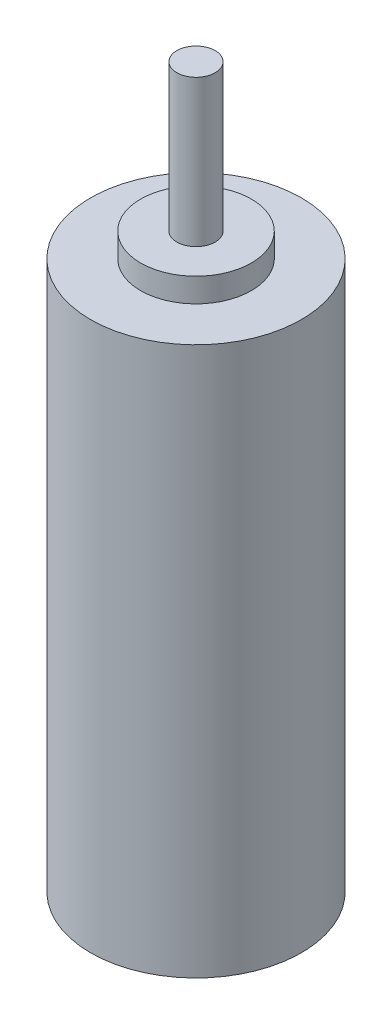
ISO-10303-21;
HEADER;
FILE_DESCRIPTION(('STEP AP214'),'2;1');
FILE_NAME('part.step','',(''),(''),'','','');
FILE_SCHEMA(('AUTOMOTIVE_DESIGN { 1 0 10303 214 1 1 1 1 }'));
ENDSEC;
DATA;
#1=APPLICATION_CONTEXT('core data for automotive mechanical design processes');
#2=APPLICATION_PROTOCOL_DEFINITION('international standard','automotive_design',2000,#1);
#3=PRODUCT_CONTEXT('',#1,'mechanical');
#4=PRODUCT('Part','Part','',(#3));
#5=PRODUCT_RELATED_PRODUCT_CATEGORY('part','',(#4));
#6=PRODUCT_DEFINITION_FORMATION('','',#4);
#7=PRODUCT_DEFINITION_CONTEXT('part definition',#1,'design');
#8=PRODUCT_DEFINITION('design','',#6,#7);
#9=PRODUCT_DEFINITION_SHAPE('','',#8);
#10=(LENGTH_UNIT() NAMED_UNIT(*) SI_UNIT(.MILLI.,.METRE.));
#11=(NAMED_UNIT(*) PLANE_ANGLE_UNIT() SI_UNIT($,.RADIAN.));
#12=(NAMED_UNIT(*) SI_UNIT($,.STERADIAN.) SOLID_ANGLE_UNIT());
#13=UNCERTAINTY_MEASURE_WITH_UNIT(LENGTH_MEASURE(1.E-05),#10,'distance_accuracy_value','');
#14=(GEOMETRIC_REPRESENTATION_CONTEXT(3) GLOBAL_UNCERTAINTY_ASSIGNED_CONTEXT((#13)) GLOBAL_UNIT_ASSIGNED_CONTEXT((#10,
#11,#12)) REPRESENTATION_CONTEXT('',''));
#15=CARTESIAN_POINT('',(0.,0.,0.));
#16=DIRECTION('',(0.,0.,1.));
#17=DIRECTION('',(1.,0.,0.));
#18=AXIS2_PLACEMENT_3D('',#15,#16,#17);
#19=CARTESIAN_POINT('',(0.,57.2,0.));
#20=DIRECTION('',(0.,-1.,0.));
#21=DIRECTION('',(0.,0.,-1.));
#22=AXIS2_PLACEMENT_3D('',#19,#20,#21);
#23=CYLINDRICAL_SURFACE('',#22,11.);
#24=CARTESIAN_POINT('',(0.,57.2,0.));
#25=DIRECTION('',(0.,1.,0.));
#26=DIRECTION('',(0.,0.,1.));
#27=AXIS2_PLACEMENT_3D('',#24,#25,#26);
#28=CIRCLE('',#27,11.);
#29=CARTESIAN_POINT('',(0.,57.2,11.));
#30=VERTEX_POINT('',#29);
#31=EDGE_CURVE('E47',#30,#30,#28,.T.);
#32=ORIENTED_EDGE('',*,*,#31,.F.);
#33=EDGE_LOOP('',(#32));
#34=FACE_BOUND('',#33,.T.);
#35=CARTESIAN_POINT('',(0.,0.,0.));
#36=DIRECTION('',(0.,1.,0.));
#37=DIRECTION('',(0.,0.,1.));
#38=AXIS2_PLACEMENT_3D('',#35,#36,#37);
#39=CIRCLE('',#38,11.);
#40=CARTESIAN_POINT('',(0.,0.,11.));
#41=VERTEX_POINT('',#40);
#42=EDGE_CURVE('E38',#41,#41,#39,.T.);
#43=ORIENTED_EDGE('',*,*,#42,.T.);
#44=EDGE_LOOP('',(#43));
#45=FACE_BOUND('',#44,.T.);
#46=ADVANCED_FACE('F35',(#34,#45),#23,.T.);
#47=CARTESIAN_POINT('',(0.,57.2,0.));
#48=DIRECTION('',(0.,1.,0.));
#49=DIRECTION('',(0.,0.,1.));
#50=AXIS2_PLACEMENT_3D('',#47,#48,#49);
#51=PLANE('',#50);
#52=CARTESIAN_POINT('',(0.,57.2,0.));
#53=DIRECTION('',(0.,1.,0.));
#54=DIRECTION('',(0.,0.,1.));
#55=AXIS2_PLACEMENT_3D('',#52,#53,#54);
#56=CIRCLE('',#55,5.7760925717428);
#57=CARTESIAN_POINT('',(0.,57.2,5.7760925717428));
#58=VERTEX_POINT('',#57);
#59=EDGE_CURVE('E42',#58,#58,#56,.T.);
#60=ORIENTED_EDGE('',*,*,#59,.F.);
#61=EDGE_LOOP('',(#60));
#62=FACE_BOUND('',#61,.T.);
#63=ORIENTED_EDGE('',*,*,#31,.T.);
#64=EDGE_LOOP('',(#63));
#65=FACE_BOUND('',#64,.T.);
#66=ADVANCED_FACE('F64',(#62,#65),#51,.T.);
#67=CARTESIAN_POINT('',(0.,0.,0.));
#68=DIRECTION('',(0.,1.,0.));
#69=DIRECTION('',(0.,0.,1.));
#70=AXIS2_PLACEMENT_3D('',#67,#68,#69);
#71=PLANE('',#70);
#72=ORIENTED_EDGE('',*,*,#42,.F.);
#73=EDGE_LOOP('',(#72));
#74=FACE_BOUND('',#73,.T.);
#75=ADVANCED_FACE('F61',(#74),#71,.F.);
#76=CARTESIAN_POINT('',(0.,59.7,0.));
#77=DIRECTION('',(0.,-1.,0.));
#78=DIRECTION('',(0.,0.,-1.));
#79=AXIS2_PLACEMENT_3D('',#76,#77,#78);
#80=CYLINDRICAL_SURFACE('',#79,5.7760925717428);
#81=CARTESIAN_POINT('',(0.,59.7,0.));
#82=DIRECTION('',(0.,1.,0.));
#83=DIRECTION('',(0.,0.,1.));
#84=AXIS2_PLACEMENT_3D('',#81,#82,#83);
#85=CIRCLE('',#84,5.7760925717428);
#86=CARTESIAN_POINT('',(0.,59.7,5.7760925717428));
#87=VERTEX_POINT('',#86);
#88=EDGE_CURVE('E52',#87,#87,#85,.T.);
#89=ORIENTED_EDGE('',*,*,#88,.F.);
#90=EDGE_LOOP('',(#89));
#91=FACE_BOUND('',#90,.T.);
#92=ORIENTED_EDGE('',*,*,#59,.T.);
#93=EDGE_LOOP('',(#92));
#94=FACE_BOUND('',#93,.T.);
#95=ADVANCED_FACE('F63',(#91,#94),#80,.T.);
#96=CARTESIAN_POINT('',(0.,59.7,0.));
#97=DIRECTION('',(0.,1.,0.));
#98=DIRECTION('',(0.,0.,1.));
#99=AXIS2_PLACEMENT_3D('',#96,#97,#98);
#100=PLANE('',#99);
#101=CARTESIAN_POINT('',(0.,59.7,0.));
#102=DIRECTION('',(0.,1.,0.));
#103=DIRECTION('',(0.,0.,1.));
#104=AXIS2_PLACEMENT_3D('',#101,#102,#103);
#105=CIRCLE('',#104,2.);
#106=CARTESIAN_POINT('',(0.,59.7,2.));
#107=VERTEX_POINT('',#106);
#108=EDGE_CURVE('E10',#107,#107,#105,.T.);
#109=ORIENTED_EDGE('',*,*,#108,.F.);
#110=EDGE_LOOP('',(#109));
#111=FACE_BOUND('',#110,.T.);
#112=ORIENTED_EDGE('',*,*,#88,.T.);
#113=EDGE_LOOP('',(#112));
#114=FACE_BOUND('',#113,.T.);
#115=ADVANCED_FACE('F69',(#111,#114),#100,.T.);
#116=CARTESIAN_POINT('',(0.,75.,0.));
#117=DIRECTION('',(0.,-1.,0.));
#118=DIRECTION('',(0.,0.,-1.));
#119=AXIS2_PLACEMENT_3D('',#116,#117,#118);
#120=CYLINDRICAL_SURFACE('',#119,2.);
#121=CARTESIAN_POINT('',(0.,75.,0.));
#122=DIRECTION('',(0.,1.,0.));
#123=DIRECTION('',(0.,0.,1.));
#124=AXIS2_PLACEMENT_3D('',#121,#122,#123);
#125=CIRCLE('',#124,2.);
#126=CARTESIAN_POINT('',(0.,75.,2.));
#127=VERTEX_POINT('',#126);
#128=EDGE_CURVE('E51',#127,#127,#125,.T.);
#129=ORIENTED_EDGE('',*,*,#128,.F.);
#130=EDGE_LOOP('',(#129));
#131=FACE_BOUND('',#130,.T.);
#132=ORIENTED_EDGE('',*,*,#108,.T.);
#133=EDGE_LOOP('',(#132));
#134=FACE_BOUND('',#133,.T.);
#135=ADVANCED_FACE('F101',(#131,#134),#120,.T.);
#136=CARTESIAN_POINT('',(0.,75.,0.));
#137=DIRECTION('',(0.,1.,0.));
#138=DIRECTION('',(0.,0.,1.));
#139=AXIS2_PLACEMENT_3D('',#136,#137,#138);
#140=PLANE('',#139);
#141=ORIENTED_EDGE('',*,*,#128,.T.);
#142=EDGE_LOOP('',(#141));
#143=FACE_BOUND('',#142,.T.);
#144=ADVANCED_FACE('F112',(#143),#140,.T.);
#145=CLOSED_SHELL('',(#46,#66,#75,#95,#115,#135,#144));
#146=MANIFOLD_SOLID_BREP('B2',#145);
#147=ADVANCED_BREP_SHAPE_REPRESENTATION('',(#18,#146),#14);
#148=SHAPE_DEFINITION_REPRESENTATION(#9,#147);
ENDSEC;
END-ISO-10303-21;
